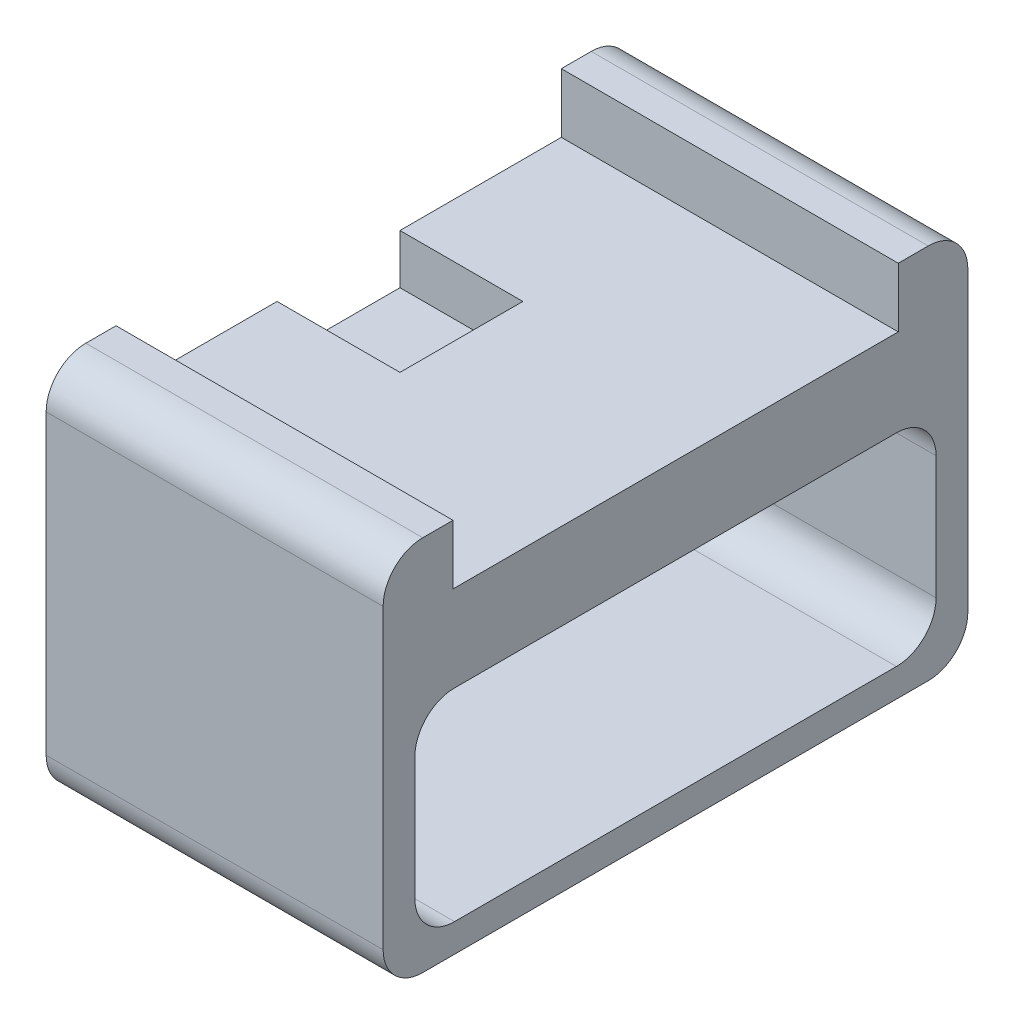
ISO-10303-21;
HEADER;
FILE_DESCRIPTION(('STEP AP214'),'2;1');
FILE_NAME('part.step','',(''),(''),'','','');
FILE_SCHEMA(('AUTOMOTIVE_DESIGN { 1 0 10303 214 1 1 1 1 }'));
ENDSEC;
DATA;
#1=APPLICATION_CONTEXT('core data for automotive mechanical design processes');
#2=APPLICATION_PROTOCOL_DEFINITION('international standard','automotive_design',2000,#1);
#3=PRODUCT_CONTEXT('',#1,'mechanical');
#4=PRODUCT('Part','Part','',(#3));
#5=PRODUCT_RELATED_PRODUCT_CATEGORY('part','',(#4));
#6=PRODUCT_DEFINITION_FORMATION('','',#4);
#7=PRODUCT_DEFINITION_CONTEXT('part definition',#1,'design');
#8=PRODUCT_DEFINITION('design','',#6,#7);
#9=PRODUCT_DEFINITION_SHAPE('','',#8);
#10=(LENGTH_UNIT() NAMED_UNIT(*) SI_UNIT(.MILLI.,.METRE.));
#11=(NAMED_UNIT(*) PLANE_ANGLE_UNIT() SI_UNIT($,.RADIAN.));
#12=(NAMED_UNIT(*) SI_UNIT($,.STERADIAN.) SOLID_ANGLE_UNIT());
#13=UNCERTAINTY_MEASURE_WITH_UNIT(LENGTH_MEASURE(1.E-05),#10,'distance_accuracy_value','');
#14=(GEOMETRIC_REPRESENTATION_CONTEXT(3) GLOBAL_UNCERTAINTY_ASSIGNED_CONTEXT((#13)) GLOBAL_UNIT_ASSIGNED_CONTEXT((#10,
#11,#12)) REPRESENTATION_CONTEXT('',''));
#15=CARTESIAN_POINT('',(0.,0.,0.));
#16=DIRECTION('',(0.,0.,1.));
#17=DIRECTION('',(1.,0.,0.));
#18=AXIS2_PLACEMENT_3D('',#15,#16,#17);
#19=CARTESIAN_POINT('',(21.,9.5,12.75));
#20=DIRECTION('',(0.,-1.,0.));
#21=DIRECTION('',(0.,0.,-1.));
#22=AXIS2_PLACEMENT_3D('',#19,#20,#21);
#23=PLANE('',#22);
#24=DIRECTION('',(0.,0.,1.));
#25=VECTOR('',#24,1.);
#26=CARTESIAN_POINT('',(17.,9.5,12.75));
#27=LINE('',#26,#25);
#28=CARTESIAN_POINT('',(17.,9.5,-12.75));
#29=VERTEX_POINT('',#28);
#30=CARTESIAN_POINT('',(17.,9.5,-11.2400373427258));
#31=VERTEX_POINT('',#30);
#32=EDGE_CURVE('E359',#29,#31,#27,.T.);
#33=ORIENTED_EDGE('',*,*,#32,.F.);
#34=DIRECTION('',(-1.,0.,0.));
#35=VECTOR('',#34,1.);
#36=CARTESIAN_POINT('',(21.,9.5,-12.75));
#37=LINE('',#36,#35);
#38=CARTESIAN_POINT('',(0.,9.5,-12.75));
#39=VERTEX_POINT('',#38);
#40=EDGE_CURVE('E301',#29,#39,#37,.T.);
#41=ORIENTED_EDGE('',*,*,#40,.T.);
#42=DIRECTION('',(0.,0.,1.));
#43=VECTOR('',#42,1.);
#44=CARTESIAN_POINT('',(0.,9.5,12.75));
#45=LINE('',#44,#43);
#46=CARTESIAN_POINT('',(0.,9.5,-11.2400373427258));
#47=VERTEX_POINT('',#46);
#48=EDGE_CURVE('E276',#39,#47,#45,.T.);
#49=ORIENTED_EDGE('',*,*,#48,.T.);
#50=DIRECTION('',(-1.,0.,0.));
#51=VECTOR('',#50,1.);
#52=CARTESIAN_POINT('',(0.,9.5,-11.2400373427258));
#53=LINE('',#52,#51);
#54=EDGE_CURVE('E218',#31,#47,#53,.T.);
#55=ORIENTED_EDGE('',*,*,#54,.F.);
#56=EDGE_LOOP('',(#33,#41,#49,#55));
#57=FACE_BOUND('',#56,.T.);
#58=ADVANCED_FACE('F33',(#57),#23,.F.);
#59=CARTESIAN_POINT('',(21.,-7.5,-12.75));
#60=DIRECTION('',(-1.,0.,0.));
#61=DIRECTION('',(0.,0.,1.));
#62=AXIS2_PLACEMENT_3D('',#59,#60,#61);
#63=CYLINDRICAL_SURFACE('',#62,2.);
#64=CARTESIAN_POINT('',(17.,-7.5,-12.75));
#65=DIRECTION('',(1.,0.,0.));
#66=DIRECTION('',(0.,0.,-1.));
#67=AXIS2_PLACEMENT_3D('',#64,#65,#66);
#68=CIRCLE('',#67,2.);
#69=CARTESIAN_POINT('',(17.,-9.49999999999999,-12.75));
#70=VERTEX_POINT('',#69);
#71=CARTESIAN_POINT('',(17.,-7.5,-14.75));
#72=VERTEX_POINT('',#71);
#73=EDGE_CURVE('E370',#70,#72,#68,.T.);
#74=ORIENTED_EDGE('',*,*,#73,.F.);
#75=DIRECTION('',(-1.,0.,0.));
#76=VECTOR('',#75,1.);
#77=CARTESIAN_POINT('',(21.,-9.5,-12.75));
#78=LINE('',#77,#76);
#79=CARTESIAN_POINT('',(0.,-9.5,-12.75));
#80=VERTEX_POINT('',#79);
#81=EDGE_CURVE('E291',#70,#80,#78,.T.);
#82=ORIENTED_EDGE('',*,*,#81,.T.);
#83=CARTESIAN_POINT('',(0.,-7.5,-12.75));
#84=DIRECTION('',(1.,0.,0.));
#85=DIRECTION('',(0.,0.,1.));
#86=AXIS2_PLACEMENT_3D('',#83,#84,#85);
#87=CIRCLE('',#86,2.);
#88=CARTESIAN_POINT('',(0.,-7.5,-14.75));
#89=VERTEX_POINT('',#88);
#90=EDGE_CURVE('E258',#80,#89,#87,.T.);
#91=ORIENTED_EDGE('',*,*,#90,.T.);
#92=DIRECTION('',(-1.,0.,0.));
#93=VECTOR('',#92,1.);
#94=CARTESIAN_POINT('',(21.,-7.5,-14.75));
#95=LINE('',#94,#93);
#96=EDGE_CURVE('E305',#72,#89,#95,.T.);
#97=ORIENTED_EDGE('',*,*,#96,.F.);
#98=EDGE_LOOP('',(#74,#82,#91,#97));
#99=FACE_BOUND('',#98,.T.);
#100=ADVANCED_FACE('F35',(#99),#63,.T.);
#101=CARTESIAN_POINT('',(21.,-7.5,-14.75));
#102=DIRECTION('',(0.,0.,1.));
#103=DIRECTION('',(0.,-1.,0.));
#104=AXIS2_PLACEMENT_3D('',#101,#102,#103);
#105=PLANE('',#104);
#106=DIRECTION('',(0.,1.,0.));
#107=VECTOR('',#106,1.);
#108=CARTESIAN_POINT('',(17.,-7.5,-14.75));
#109=LINE('',#108,#107);
#110=CARTESIAN_POINT('',(17.,7.5,-14.75));
#111=VERTEX_POINT('',#110);
#112=EDGE_CURVE('E368',#72,#111,#109,.T.);
#113=ORIENTED_EDGE('',*,*,#112,.F.);
#114=ORIENTED_EDGE('',*,*,#96,.T.);
#115=DIRECTION('',(0.,1.,0.));
#116=VECTOR('',#115,1.);
#117=CARTESIAN_POINT('',(0.,-7.5,-14.75));
#118=LINE('',#117,#116);
#119=CARTESIAN_POINT('',(0.,7.5,-14.75));
#120=VERTEX_POINT('',#119);
#121=EDGE_CURVE('E269',#89,#120,#118,.T.);
#122=ORIENTED_EDGE('',*,*,#121,.T.);
#123=DIRECTION('',(-1.,0.,0.));
#124=VECTOR('',#123,1.);
#125=CARTESIAN_POINT('',(21.,7.5,-14.75));
#126=LINE('',#125,#124);
#127=EDGE_CURVE('E303',#111,#120,#126,.T.);
#128=ORIENTED_EDGE('',*,*,#127,.F.);
#129=EDGE_LOOP('',(#113,#114,#122,#128));
#130=FACE_BOUND('',#129,.T.);
#131=ADVANCED_FACE('F443',(#130),#105,.F.);
#132=CARTESIAN_POINT('',(21.,7.5,-12.75));
#133=DIRECTION('',(-1.,0.,0.));
#134=DIRECTION('',(0.,0.,1.));
#135=AXIS2_PLACEMENT_3D('',#132,#133,#134);
#136=CYLINDRICAL_SURFACE('',#135,2.);
#137=CARTESIAN_POINT('',(17.,7.5,-12.75));
#138=DIRECTION('',(1.,0.,0.));
#139=DIRECTION('',(0.,0.,-1.));
#140=AXIS2_PLACEMENT_3D('',#137,#138,#139);
#141=CIRCLE('',#140,2.);
#142=EDGE_CURVE('E366',#111,#29,#141,.T.);
#143=ORIENTED_EDGE('',*,*,#142,.F.);
#144=ORIENTED_EDGE('',*,*,#127,.T.);
#145=CARTESIAN_POINT('',(0.,7.5,-12.75));
#146=DIRECTION('',(1.,0.,0.));
#147=DIRECTION('',(0.,0.,1.));
#148=AXIS2_PLACEMENT_3D('',#145,#146,#147);
#149=CIRCLE('',#148,2.);
#150=EDGE_CURVE('E272',#120,#39,#149,.T.);
#151=ORIENTED_EDGE('',*,*,#150,.T.);
#152=ORIENTED_EDGE('',*,*,#40,.F.);
#153=EDGE_LOOP('',(#143,#144,#151,#152));
#154=FACE_BOUND('',#153,.T.);
#155=ADVANCED_FACE('F450',(#154),#136,.T.);
#156=DIRECTION('',(0.,0.,1.));
#157=VECTOR('',#156,1.);
#158=CARTESIAN_POINT('',(17.,9.5,12.75));
#159=LINE('',#158,#157);
#160=CARTESIAN_POINT('',(17.,9.5,11.2248067322085));
#161=VERTEX_POINT('',#160);
#162=CARTESIAN_POINT('',(17.,9.5,12.75));
#163=VERTEX_POINT('',#162);
#164=EDGE_CURVE('E357',#161,#163,#159,.T.);
#165=ORIENTED_EDGE('',*,*,#164,.F.);
#166=DIRECTION('',(1.,0.,0.));
#167=VECTOR('',#166,1.);
#168=CARTESIAN_POINT('',(0.,9.5,11.2248067322085));
#169=LINE('',#168,#167);
#170=CARTESIAN_POINT('',(0.,9.5,11.2248067322085));
#171=VERTEX_POINT('',#170);
#172=EDGE_CURVE('E204',#171,#161,#169,.T.);
#173=ORIENTED_EDGE('',*,*,#172,.F.);
#174=CARTESIAN_POINT('',(0.,9.5,12.75));
#175=VERTEX_POINT('',#174);
#176=EDGE_CURVE('E275',#171,#175,#45,.T.);
#177=ORIENTED_EDGE('',*,*,#176,.T.);
#178=DIRECTION('',(-1.,0.,0.));
#179=VECTOR('',#178,1.);
#180=CARTESIAN_POINT('',(21.,9.5,12.75));
#181=LINE('',#180,#179);
#182=EDGE_CURVE('E299',#163,#175,#181,.T.);
#183=ORIENTED_EDGE('',*,*,#182,.F.);
#184=EDGE_LOOP('',(#165,#173,#177,#183));
#185=FACE_BOUND('',#184,.T.);
#186=ADVANCED_FACE('F355',(#185),#23,.F.);
#187=CARTESIAN_POINT('',(21.,7.5,12.75));
#188=DIRECTION('',(-1.,0.,0.));
#189=DIRECTION('',(0.,0.,1.));
#190=AXIS2_PLACEMENT_3D('',#187,#188,#189);
#191=CYLINDRICAL_SURFACE('',#190,2.);
#192=CARTESIAN_POINT('',(17.,7.5,12.75));
#193=DIRECTION('',(1.,0.,0.));
#194=DIRECTION('',(0.,0.,-1.));
#195=AXIS2_PLACEMENT_3D('',#192,#193,#194);
#196=CIRCLE('',#195,2.);
#197=CARTESIAN_POINT('',(17.,7.5,14.75));
#198=VERTEX_POINT('',#197);
#199=EDGE_CURVE('E361',#163,#198,#196,.T.);
#200=ORIENTED_EDGE('',*,*,#199,.F.);
#201=ORIENTED_EDGE('',*,*,#182,.T.);
#202=CARTESIAN_POINT('',(0.,7.5,12.75));
#203=DIRECTION('',(1.,0.,0.));
#204=DIRECTION('',(0.,0.,-1.));
#205=AXIS2_PLACEMENT_3D('',#202,#203,#204);
#206=CIRCLE('',#205,2.);
#207=CARTESIAN_POINT('',(0.,7.5,14.75));
#208=VERTEX_POINT('',#207);
#209=EDGE_CURVE('E279',#175,#208,#206,.T.);
#210=ORIENTED_EDGE('',*,*,#209,.T.);
#211=DIRECTION('',(-1.,0.,0.));
#212=VECTOR('',#211,1.);
#213=CARTESIAN_POINT('',(21.,7.5,14.75));
#214=LINE('',#213,#212);
#215=EDGE_CURVE('E297',#198,#208,#214,.T.);
#216=ORIENTED_EDGE('',*,*,#215,.F.);
#217=EDGE_LOOP('',(#200,#201,#210,#216));
#218=FACE_BOUND('',#217,.T.);
#219=ADVANCED_FACE('F449',(#218),#191,.T.);
#220=CARTESIAN_POINT('',(21.,-7.5,14.75));
#221=DIRECTION('',(0.,0.,-1.));
#222=DIRECTION('',(-1.,0.,0.));
#223=AXIS2_PLACEMENT_3D('',#220,#221,#222);
#224=PLANE('',#223);
#225=DIRECTION('',(0.,-1.,0.));
#226=VECTOR('',#225,1.);
#227=CARTESIAN_POINT('',(17.,-7.5,14.75));
#228=LINE('',#227,#226);
#229=CARTESIAN_POINT('',(17.,-7.5,14.75));
#230=VERTEX_POINT('',#229);
#231=EDGE_CURVE('E376',#198,#230,#228,.T.);
#232=ORIENTED_EDGE('',*,*,#231,.F.);
#233=ORIENTED_EDGE('',*,*,#215,.T.);
#234=DIRECTION('',(0.,-1.,0.));
#235=VECTOR('',#234,1.);
#236=CARTESIAN_POINT('',(0.,-7.5,14.75));
#237=LINE('',#236,#235);
#238=CARTESIAN_POINT('',(0.,-7.5,14.75));
#239=VERTEX_POINT('',#238);
#240=EDGE_CURVE('E282',#208,#239,#237,.T.);
#241=ORIENTED_EDGE('',*,*,#240,.T.);
#242=DIRECTION('',(-1.,0.,0.));
#243=VECTOR('',#242,1.);
#244=CARTESIAN_POINT('',(21.,-7.5,14.75));
#245=LINE('',#244,#243);
#246=EDGE_CURVE('E295',#230,#239,#245,.T.);
#247=ORIENTED_EDGE('',*,*,#246,.F.);
#248=EDGE_LOOP('',(#232,#233,#241,#247));
#249=FACE_BOUND('',#248,.T.);
#250=ADVANCED_FACE('F455',(#249),#224,.F.);
#251=CARTESIAN_POINT('',(21.,-7.5,12.75));
#252=DIRECTION('',(-1.,0.,0.));
#253=DIRECTION('',(0.,0.,1.));
#254=AXIS2_PLACEMENT_3D('',#251,#252,#253);
#255=CYLINDRICAL_SURFACE('',#254,2.);
#256=CARTESIAN_POINT('',(17.,-7.5,12.75));
#257=DIRECTION('',(1.,0.,0.));
#258=DIRECTION('',(0.,0.,-1.));
#259=AXIS2_PLACEMENT_3D('',#256,#257,#258);
#260=CIRCLE('',#259,2.);
#261=CARTESIAN_POINT('',(17.,-9.5,12.75));
#262=VERTEX_POINT('',#261);
#263=EDGE_CURVE('E374',#230,#262,#260,.T.);
#264=ORIENTED_EDGE('',*,*,#263,.F.);
#265=ORIENTED_EDGE('',*,*,#246,.T.);
#266=CARTESIAN_POINT('',(0.,-7.5,12.75));
#267=DIRECTION('',(1.,0.,0.));
#268=DIRECTION('',(0.,0.,-1.));
#269=AXIS2_PLACEMENT_3D('',#266,#267,#268);
#270=CIRCLE('',#269,2.);
#271=CARTESIAN_POINT('',(0.,-9.5,12.75));
#272=VERTEX_POINT('',#271);
#273=EDGE_CURVE('E285',#239,#272,#270,.T.);
#274=ORIENTED_EDGE('',*,*,#273,.T.);
#275=DIRECTION('',(-1.,0.,0.));
#276=VECTOR('',#275,1.);
#277=CARTESIAN_POINT('',(21.,-9.5,12.75));
#278=LINE('',#277,#276);
#279=EDGE_CURVE('E293',#262,#272,#278,.T.);
#280=ORIENTED_EDGE('',*,*,#279,.F.);
#281=EDGE_LOOP('',(#264,#265,#274,#280));
#282=FACE_BOUND('',#281,.T.);
#283=ADVANCED_FACE('F506',(#282),#255,.T.);
#284=CARTESIAN_POINT('',(21.,-9.5,12.75));
#285=DIRECTION('',(0.,1.,0.));
#286=DIRECTION('',(0.,0.,1.));
#287=AXIS2_PLACEMENT_3D('',#284,#285,#286);
#288=PLANE('',#287);
#289=DIRECTION('',(0.,0.,-1.));
#290=VECTOR('',#289,1.);
#291=CARTESIAN_POINT('',(17.,-9.5,12.75));
#292=LINE('',#291,#290);
#293=EDGE_CURVE('E372',#262,#70,#292,.T.);
#294=ORIENTED_EDGE('',*,*,#293,.F.);
#295=ORIENTED_EDGE('',*,*,#279,.T.);
#296=DIRECTION('',(0.,0.,-1.));
#297=VECTOR('',#296,1.);
#298=CARTESIAN_POINT('',(0.,-9.5,12.75));
#299=LINE('',#298,#297);
#300=EDGE_CURVE('E288',#272,#80,#299,.T.);
#301=ORIENTED_EDGE('',*,*,#300,.T.);
#302=ORIENTED_EDGE('',*,*,#81,.F.);
#303=EDGE_LOOP('',(#294,#295,#301,#302));
#304=FACE_BOUND('',#303,.T.);
#305=ADVANCED_FACE('F503',(#304),#288,.F.);
#306=CARTESIAN_POINT('',(21.,-6.07292875406995,11.147623692795));
#307=DIRECTION('',(-1.,0.,0.));
#308=DIRECTION('',(0.,0.,1.));
#309=AXIS2_PLACEMENT_3D('',#306,#307,#308);
#310=CYLINDRICAL_SURFACE('',#309,2.);
#311=CARTESIAN_POINT('',(17.,-6.07292875406995,11.147623692795));
#312=DIRECTION('',(1.,0.,0.));
#313=DIRECTION('',(0.,0.,-1.));
#314=AXIS2_PLACEMENT_3D('',#311,#312,#313);
#315=CIRCLE('',#314,2.);
#316=CARTESIAN_POINT('',(17.,-8.07292875406995,11.147623692795));
#317=VERTEX_POINT('',#316);
#318=CARTESIAN_POINT('',(17.,-6.07292875406995,13.147623692795));
#319=VERTEX_POINT('',#318);
#320=EDGE_CURVE('E48',#317,#319,#315,.F.);
#321=ORIENTED_EDGE('',*,*,#320,.F.);
#322=DIRECTION('',(-1.,0.,0.));
#323=VECTOR('',#322,1.);
#324=CARTESIAN_POINT('',(21.,-8.07292875406995,11.147623692795));
#325=LINE('',#324,#323);
#326=CARTESIAN_POINT('',(0.,-8.07292875406995,11.147623692795));
#327=VERTEX_POINT('',#326);
#328=EDGE_CURVE('E231',#317,#327,#325,.T.);
#329=ORIENTED_EDGE('',*,*,#328,.T.);
#330=CARTESIAN_POINT('',(0.,-6.07292875406995,11.147623692795));
#331=DIRECTION('',(-1.,0.,0.));
#332=DIRECTION('',(0.,0.,1.));
#333=AXIS2_PLACEMENT_3D('',#330,#331,#332);
#334=CIRCLE('',#333,2.);
#335=CARTESIAN_POINT('',(0.,-6.07292875406995,13.147623692795));
#336=VERTEX_POINT('',#335);
#337=EDGE_CURVE('E328',#327,#336,#334,.T.);
#338=ORIENTED_EDGE('',*,*,#337,.T.);
#339=DIRECTION('',(-1.,0.,0.));
#340=VECTOR('',#339,1.);
#341=CARTESIAN_POINT('',(21.,-6.07292875406995,13.147623692795));
#342=LINE('',#341,#340);
#343=EDGE_CURVE('E228',#319,#336,#342,.T.);
#344=ORIENTED_EDGE('',*,*,#343,.F.);
#345=EDGE_LOOP('',(#321,#329,#338,#344));
#346=FACE_BOUND('',#345,.T.);
#347=ADVANCED_FACE('F398',(#346),#310,.F.);
#348=CARTESIAN_POINT('',(21.,-8.07292875406995,-11.147623692795));
#349=DIRECTION('',(0.,-1.,0.));
#350=DIRECTION('',(0.,0.,-1.));
#351=AXIS2_PLACEMENT_3D('',#348,#349,#350);
#352=PLANE('',#351);
#353=DIRECTION('',(0.,0.,1.));
#354=VECTOR('',#353,1.);
#355=CARTESIAN_POINT('',(17.,-8.07292875406995,-11.147623692795));
#356=LINE('',#355,#354);
#357=CARTESIAN_POINT('',(17.,-8.07292875406995,-11.147623692795));
#358=VERTEX_POINT('',#357);
#359=EDGE_CURVE('E390',#358,#317,#356,.T.);
#360=ORIENTED_EDGE('',*,*,#359,.F.);
#361=DIRECTION('',(-1.,0.,0.));
#362=VECTOR('',#361,1.);
#363=CARTESIAN_POINT('',(21.,-8.07292875406995,-11.147623692795));
#364=LINE('',#363,#362);
#365=CARTESIAN_POINT('',(0.,-8.07292875406995,-11.147623692795));
#366=VERTEX_POINT('',#365);
#367=EDGE_CURVE('E229',#358,#366,#364,.T.);
#368=ORIENTED_EDGE('',*,*,#367,.T.);
#369=DIRECTION('',(0.,0.,-1.));
#370=VECTOR('',#369,1.);
#371=CARTESIAN_POINT('',(0.,-8.07292875406995,-11.147623692795));
#372=LINE('',#371,#370);
#373=EDGE_CURVE('E325',#366,#327,#372,.F.);
#374=ORIENTED_EDGE('',*,*,#373,.T.);
#375=ORIENTED_EDGE('',*,*,#328,.F.);
#376=EDGE_LOOP('',(#360,#368,#374,#375));
#377=FACE_BOUND('',#376,.T.);
#378=ADVANCED_FACE('F399',(#377),#352,.F.);
#379=CARTESIAN_POINT('',(21.,-6.07292875406995,-11.147623692795));
#380=DIRECTION('',(-1.,0.,0.));
#381=DIRECTION('',(0.,0.,1.));
#382=AXIS2_PLACEMENT_3D('',#379,#380,#381);
#383=CYLINDRICAL_SURFACE('',#382,2.);
#384=CARTESIAN_POINT('',(17.,-6.07292875406995,-11.147623692795));
#385=DIRECTION('',(1.,0.,0.));
#386=DIRECTION('',(0.,0.,-1.));
#387=AXIS2_PLACEMENT_3D('',#384,#385,#386);
#388=CIRCLE('',#387,2.);
#389=CARTESIAN_POINT('',(17.,-6.07292875406995,-13.147623692795));
#390=VERTEX_POINT('',#389);
#391=EDGE_CURVE('E388',#390,#358,#388,.F.);
#392=ORIENTED_EDGE('',*,*,#391,.F.);
#393=DIRECTION('',(-1.,0.,0.));
#394=VECTOR('',#393,1.);
#395=CARTESIAN_POINT('',(21.,-6.07292875406995,-13.147623692795));
#396=LINE('',#395,#394);
#397=CARTESIAN_POINT('',(0.,-6.07292875406995,-13.147623692795));
#398=VERTEX_POINT('',#397);
#399=EDGE_CURVE('E232',#390,#398,#396,.T.);
#400=ORIENTED_EDGE('',*,*,#399,.T.);
#401=CARTESIAN_POINT('',(0.,-6.07292875406995,-11.147623692795));
#402=DIRECTION('',(-1.,0.,0.));
#403=DIRECTION('',(0.,0.,1.));
#404=AXIS2_PLACEMENT_3D('',#401,#402,#403);
#405=CIRCLE('',#404,2.);
#406=EDGE_CURVE('E322',#398,#366,#405,.T.);
#407=ORIENTED_EDGE('',*,*,#406,.T.);
#408=ORIENTED_EDGE('',*,*,#367,.F.);
#409=EDGE_LOOP('',(#392,#400,#407,#408));
#410=FACE_BOUND('',#409,.T.);
#411=ADVANCED_FACE('F428',(#410),#383,.F.);
#412=CARTESIAN_POINT('',(21.,-6.07292875406995,-13.147623692795));
#413=DIRECTION('',(0.,0.,-1.));
#414=DIRECTION('',(-1.,0.,0.));
#415=AXIS2_PLACEMENT_3D('',#412,#413,#414);
#416=PLANE('',#415);
#417=DIRECTION('',(0.,-1.,0.));
#418=VECTOR('',#417,1.);
#419=CARTESIAN_POINT('',(17.,-6.07292875406995,-13.147623692795));
#420=LINE('',#419,#418);
#421=CARTESIAN_POINT('',(17.,0.135263403800991,-13.147623692795));
#422=VERTEX_POINT('',#421);
#423=EDGE_CURVE('E386',#422,#390,#420,.T.);
#424=ORIENTED_EDGE('',*,*,#423,.F.);
#425=DIRECTION('',(-1.,0.,0.));
#426=VECTOR('',#425,1.);
#427=CARTESIAN_POINT('',(21.,0.135263403800991,-13.147623692795));
#428=LINE('',#427,#426);
#429=CARTESIAN_POINT('',(0.,0.135263403800991,-13.147623692795));
#430=VERTEX_POINT('',#429);
#431=EDGE_CURVE('E238',#422,#430,#428,.T.);
#432=ORIENTED_EDGE('',*,*,#431,.T.);
#433=DIRECTION('',(0.,1.,0.));
#434=VECTOR('',#433,1.);
#435=CARTESIAN_POINT('',(0.,-6.07292875406995,-13.147623692795));
#436=LINE('',#435,#434);
#437=EDGE_CURVE('E319',#430,#398,#436,.F.);
#438=ORIENTED_EDGE('',*,*,#437,.T.);
#439=ORIENTED_EDGE('',*,*,#399,.F.);
#440=EDGE_LOOP('',(#424,#432,#438,#439));
#441=FACE_BOUND('',#440,.T.);
#442=ADVANCED_FACE('F425',(#441),#416,.F.);
#443=CARTESIAN_POINT('',(21.,0.135263403800991,-11.147623692795));
#444=DIRECTION('',(-1.,0.,0.));
#445=DIRECTION('',(0.,0.,1.));
#446=AXIS2_PLACEMENT_3D('',#443,#444,#445);
#447=CYLINDRICAL_SURFACE('',#446,2.);
#448=CARTESIAN_POINT('',(17.,0.135263403800991,-11.147623692795));
#449=DIRECTION('',(1.,0.,0.));
#450=DIRECTION('',(0.,0.,-1.));
#451=AXIS2_PLACEMENT_3D('',#448,#449,#450);
#452=CIRCLE('',#451,2.);
#453=CARTESIAN_POINT('',(17.,2.13526340380099,-11.147623692795));
#454=VERTEX_POINT('',#453);
#455=EDGE_CURVE('E384',#454,#422,#452,.F.);
#456=ORIENTED_EDGE('',*,*,#455,.F.);
#457=DIRECTION('',(-1.,0.,0.));
#458=VECTOR('',#457,1.);
#459=CARTESIAN_POINT('',(21.,2.13526340380099,-11.147623692795));
#460=LINE('',#459,#458);
#461=CARTESIAN_POINT('',(0.,2.13526340380099,-11.147623692795));
#462=VERTEX_POINT('',#461);
#463=EDGE_CURVE('E240',#454,#462,#460,.T.);
#464=ORIENTED_EDGE('',*,*,#463,.T.);
#465=CARTESIAN_POINT('',(0.,0.135263403800991,-11.147623692795));
#466=DIRECTION('',(-1.,0.,0.));
#467=DIRECTION('',(0.,0.,1.));
#468=AXIS2_PLACEMENT_3D('',#465,#466,#467);
#469=CIRCLE('',#468,2.);
#470=EDGE_CURVE('E316',#462,#430,#469,.T.);
#471=ORIENTED_EDGE('',*,*,#470,.T.);
#472=ORIENTED_EDGE('',*,*,#431,.F.);
#473=EDGE_LOOP('',(#456,#464,#471,#472));
#474=FACE_BOUND('',#473,.T.);
#475=ADVANCED_FACE('F422',(#474),#447,.F.);
#476=CARTESIAN_POINT('',(21.,2.13526340380099,-11.147623692795));
#477=DIRECTION('',(0.,1.,0.));
#478=DIRECTION('',(0.,0.,1.));
#479=AXIS2_PLACEMENT_3D('',#476,#477,#478);
#480=PLANE('',#479);
#481=DIRECTION('',(0.,0.,-1.));
#482=VECTOR('',#481,1.);
#483=CARTESIAN_POINT('',(17.,2.13526340380099,-11.147623692795));
#484=LINE('',#483,#482);
#485=CARTESIAN_POINT('',(17.,2.13526340380099,11.147623692795));
#486=VERTEX_POINT('',#485);
#487=EDGE_CURVE('E382',#486,#454,#484,.T.);
#488=ORIENTED_EDGE('',*,*,#487,.F.);
#489=DIRECTION('',(-1.,0.,0.));
#490=VECTOR('',#489,1.);
#491=CARTESIAN_POINT('',(21.,2.13526340380099,11.147623692795));
#492=LINE('',#491,#490);
#493=CARTESIAN_POINT('',(0.,2.13526340380099,11.147623692795));
#494=VERTEX_POINT('',#493);
#495=EDGE_CURVE('E242',#486,#494,#492,.T.);
#496=ORIENTED_EDGE('',*,*,#495,.T.);
#497=DIRECTION('',(0.,0.,1.));
#498=VECTOR('',#497,1.);
#499=CARTESIAN_POINT('',(0.,2.13526340380099,-11.147623692795));
#500=LINE('',#499,#498);
#501=EDGE_CURVE('E313',#494,#462,#500,.F.);
#502=ORIENTED_EDGE('',*,*,#501,.T.);
#503=ORIENTED_EDGE('',*,*,#463,.F.);
#504=EDGE_LOOP('',(#488,#496,#502,#503));
#505=FACE_BOUND('',#504,.T.);
#506=ADVANCED_FACE('F415',(#505),#480,.F.);
#507=CARTESIAN_POINT('',(21.,0.135263403800991,11.147623692795));
#508=DIRECTION('',(-1.,0.,0.));
#509=DIRECTION('',(0.,0.,1.));
#510=AXIS2_PLACEMENT_3D('',#507,#508,#509);
#511=CYLINDRICAL_SURFACE('',#510,2.);
#512=CARTESIAN_POINT('',(17.,0.135263403800991,11.147623692795));
#513=DIRECTION('',(1.,0.,0.));
#514=DIRECTION('',(0.,0.,-1.));
#515=AXIS2_PLACEMENT_3D('',#512,#513,#514);
#516=CIRCLE('',#515,2.);
#517=CARTESIAN_POINT('',(17.,0.135263403800992,13.147623692795));
#518=VERTEX_POINT('',#517);
#519=EDGE_CURVE('E380',#518,#486,#516,.F.);
#520=ORIENTED_EDGE('',*,*,#519,.F.);
#521=DIRECTION('',(-1.,0.,0.));
#522=VECTOR('',#521,1.);
#523=CARTESIAN_POINT('',(21.,0.135263403800991,13.147623692795));
#524=LINE('',#523,#522);
#525=CARTESIAN_POINT('',(0.,0.135263403800991,13.147623692795));
#526=VERTEX_POINT('',#525);
#527=EDGE_CURVE('E236',#518,#526,#524,.T.);
#528=ORIENTED_EDGE('',*,*,#527,.T.);
#529=CARTESIAN_POINT('',(0.,0.135263403800991,11.147623692795));
#530=DIRECTION('',(-1.,0.,0.));
#531=DIRECTION('',(0.,0.,1.));
#532=AXIS2_PLACEMENT_3D('',#529,#530,#531);
#533=CIRCLE('',#532,2.);
#534=EDGE_CURVE('E310',#526,#494,#533,.T.);
#535=ORIENTED_EDGE('',*,*,#534,.T.);
#536=ORIENTED_EDGE('',*,*,#495,.F.);
#537=EDGE_LOOP('',(#520,#528,#535,#536));
#538=FACE_BOUND('',#537,.T.);
#539=ADVANCED_FACE('F413',(#538),#511,.F.);
#540=CARTESIAN_POINT('',(21.,-6.07292875406995,13.147623692795));
#541=DIRECTION('',(0.,0.,1.));
#542=DIRECTION('',(1.,0.,0.));
#543=AXIS2_PLACEMENT_3D('',#540,#541,#542);
#544=PLANE('',#543);
#545=DIRECTION('',(0.,1.,0.));
#546=VECTOR('',#545,1.);
#547=CARTESIAN_POINT('',(17.,-6.07292875406995,13.147623692795));
#548=LINE('',#547,#546);
#549=EDGE_CURVE('E378',#319,#518,#548,.T.);
#550=ORIENTED_EDGE('',*,*,#549,.F.);
#551=ORIENTED_EDGE('',*,*,#343,.T.);
#552=DIRECTION('',(0.,1.,0.));
#553=VECTOR('',#552,1.);
#554=CARTESIAN_POINT('',(0.,-6.07292875406995,13.147623692795));
#555=LINE('',#554,#553);
#556=EDGE_CURVE('E307',#336,#526,#555,.T.);
#557=ORIENTED_EDGE('',*,*,#556,.T.);
#558=ORIENTED_EDGE('',*,*,#527,.F.);
#559=EDGE_LOOP('',(#550,#551,#557,#558));
#560=FACE_BOUND('',#559,.T.);
#561=ADVANCED_FACE('F408',(#560),#544,.F.);
#562=CARTESIAN_POINT('',(0.,6.5,-11.2400373427258));
#563=DIRECTION('',(0.,0.,-1.));
#564=DIRECTION('',(-1.,0.,0.));
#565=AXIS2_PLACEMENT_3D('',#562,#563,#564);
#566=PLANE('',#565);
#567=DIRECTION('',(0.,-1.,0.));
#568=VECTOR('',#567,1.);
#569=CARTESIAN_POINT('',(17.,6.5,-11.2400373427258));
#570=LINE('',#569,#568);
#571=CARTESIAN_POINT('',(17.,6.5,-11.2400373427258));
#572=VERTEX_POINT('',#571);
#573=EDGE_CURVE('E56',#31,#572,#570,.T.);
#574=ORIENTED_EDGE('',*,*,#573,.F.);
#575=ORIENTED_EDGE('',*,*,#54,.T.);
#576=DIRECTION('',(0.,1.,0.));
#577=VECTOR('',#576,1.);
#578=CARTESIAN_POINT('',(0.,6.5,-11.2400373427258));
#579=LINE('',#578,#577);
#580=CARTESIAN_POINT('',(0.,6.5,-11.2400373427258));
#581=VERTEX_POINT('',#580);
#582=EDGE_CURVE('E220',#581,#47,#579,.T.);
#583=ORIENTED_EDGE('',*,*,#582,.F.);
#584=DIRECTION('',(-1.,0.,0.));
#585=VECTOR('',#584,1.);
#586=CARTESIAN_POINT('',(0.,6.5,-11.2400373427258));
#587=LINE('',#586,#585);
#588=EDGE_CURVE('E209',#572,#581,#587,.T.);
#589=ORIENTED_EDGE('',*,*,#588,.F.);
#590=EDGE_LOOP('',(#574,#575,#583,#589));
#591=FACE_BOUND('',#590,.T.);
#592=ADVANCED_FACE('F474',(#591),#566,.F.);
#593=CARTESIAN_POINT('',(0.,6.5,11.2248067322085));
#594=DIRECTION('',(0.,0.,1.));
#595=DIRECTION('',(0.,-1.,0.));
#596=AXIS2_PLACEMENT_3D('',#593,#594,#595);
#597=PLANE('',#596);
#598=DIRECTION('',(0.,1.,0.));
#599=VECTOR('',#598,1.);
#600=CARTESIAN_POINT('',(17.,6.5,11.2248067322085));
#601=LINE('',#600,#599);
#602=CARTESIAN_POINT('',(17.,6.5,11.2248067322085));
#603=VERTEX_POINT('',#602);
#604=EDGE_CURVE('E192',#603,#161,#601,.T.);
#605=ORIENTED_EDGE('',*,*,#604,.F.);
#606=DIRECTION('',(1.,0.,0.));
#607=VECTOR('',#606,1.);
#608=CARTESIAN_POINT('',(0.,6.5,11.2248067322085));
#609=LINE('',#608,#607);
#610=CARTESIAN_POINT('',(0.,6.5,11.2248067322085));
#611=VERTEX_POINT('',#610);
#612=EDGE_CURVE('E201',#611,#603,#609,.T.);
#613=ORIENTED_EDGE('',*,*,#612,.F.);
#614=DIRECTION('',(0.,1.,0.));
#615=VECTOR('',#614,1.);
#616=CARTESIAN_POINT('',(0.,6.5,11.2248067322085));
#617=LINE('',#616,#615);
#618=EDGE_CURVE('E212',#611,#171,#617,.T.);
#619=ORIENTED_EDGE('',*,*,#618,.T.);
#620=ORIENTED_EDGE('',*,*,#172,.T.);
#621=EDGE_LOOP('',(#605,#613,#619,#620));
#622=FACE_BOUND('',#621,.T.);
#623=ADVANCED_FACE('F200',(#622),#597,.F.);
#624=CARTESIAN_POINT('',(0.,6.5,0.));
#625=DIRECTION('',(0.,1.,0.));
#626=DIRECTION('',(0.,0.,1.));
#627=AXIS2_PLACEMENT_3D('',#624,#625,#626);
#628=PLANE('',#627);
#629=ORIENTED_EDGE('',*,*,#612,.T.);
#630=DIRECTION('',(0.,0.,-1.));
#631=VECTOR('',#630,1.);
#632=CARTESIAN_POINT('',(17.,6.5,0.));
#633=LINE('',#632,#631);
#634=EDGE_CURVE('E11',#603,#572,#633,.T.);
#635=ORIENTED_EDGE('',*,*,#634,.T.);
#636=ORIENTED_EDGE('',*,*,#588,.T.);
#637=DIRECTION('',(0.,0.,1.));
#638=VECTOR('',#637,1.);
#639=CARTESIAN_POINT('',(0.,6.5,-11.2400373427258));
#640=LINE('',#639,#638);
#641=CARTESIAN_POINT('',(0.,6.5,-3.1));
#642=VERTEX_POINT('',#641);
#643=EDGE_CURVE('E210',#581,#642,#640,.T.);
#644=ORIENTED_EDGE('',*,*,#643,.T.);
#645=DIRECTION('',(1.,0.,0.));
#646=VECTOR('',#645,1.);
#647=CARTESIAN_POINT('',(6.2,6.5,-3.1));
#648=LINE('',#647,#646);
#649=CARTESIAN_POINT('',(6.2,6.5,-3.1));
#650=VERTEX_POINT('',#649);
#651=EDGE_CURVE('E41',#642,#650,#648,.T.);
#652=ORIENTED_EDGE('',*,*,#651,.T.);
#653=DIRECTION('',(0.,0.,1.));
#654=VECTOR('',#653,1.);
#655=CARTESIAN_POINT('',(6.2,6.5,-3.1));
#656=LINE('',#655,#654);
#657=CARTESIAN_POINT('',(6.2,6.5,3.1));
#658=VERTEX_POINT('',#657);
#659=EDGE_CURVE('E223',#650,#658,#656,.T.);
#660=ORIENTED_EDGE('',*,*,#659,.T.);
#661=DIRECTION('',(-1.,0.,0.));
#662=VECTOR('',#661,1.);
#663=CARTESIAN_POINT('',(6.2,6.5,3.1));
#664=LINE('',#663,#662);
#665=CARTESIAN_POINT('',(0.,6.5,3.1));
#666=VERTEX_POINT('',#665);
#667=EDGE_CURVE('E226',#658,#666,#664,.T.);
#668=ORIENTED_EDGE('',*,*,#667,.T.);
#669=EDGE_CURVE('E208',#666,#611,#640,.T.);
#670=ORIENTED_EDGE('',*,*,#669,.T.);
#671=EDGE_LOOP('',(#629,#635,#636,#644,#652,#660,#668,#670));
#672=FACE_BOUND('',#671,.T.);
#673=ADVANCED_FACE('F206',(#672),#628,.T.);
#674=CARTESIAN_POINT('',(6.2,4.,-3.1));
#675=DIRECTION('',(1.,0.,0.));
#676=DIRECTION('',(0.,0.,-1.));
#677=AXIS2_PLACEMENT_3D('',#674,#675,#676);
#678=PLANE('',#677);
#679=ORIENTED_EDGE('',*,*,#659,.F.);
#680=DIRECTION('',(0.,1.,0.));
#681=VECTOR('',#680,1.);
#682=CARTESIAN_POINT('',(6.2,4.,-3.1));
#683=LINE('',#682,#681);
#684=CARTESIAN_POINT('',(6.2,4.,-3.1));
#685=VERTEX_POINT('',#684);
#686=EDGE_CURVE('E254',#685,#650,#683,.T.);
#687=ORIENTED_EDGE('',*,*,#686,.F.);
#688=DIRECTION('',(0.,0.,-1.));
#689=VECTOR('',#688,1.);
#690=CARTESIAN_POINT('',(6.2,4.,-3.1));
#691=LINE('',#690,#689);
#692=CARTESIAN_POINT('',(6.2,4.,3.1));
#693=VERTEX_POINT('',#692);
#694=EDGE_CURVE('E234',#693,#685,#691,.T.);
#695=ORIENTED_EDGE('',*,*,#694,.F.);
#696=DIRECTION('',(0.,1.,0.));
#697=VECTOR('',#696,1.);
#698=CARTESIAN_POINT('',(6.2,4.,3.1));
#699=LINE('',#698,#697);
#700=EDGE_CURVE('E255',#693,#658,#699,.T.);
#701=ORIENTED_EDGE('',*,*,#700,.T.);
#702=EDGE_LOOP('',(#679,#687,#695,#701));
#703=FACE_BOUND('',#702,.T.);
#704=ADVANCED_FACE('F337',(#703),#678,.F.);
#705=CARTESIAN_POINT('',(6.2,4.,3.1));
#706=DIRECTION('',(0.,0.,1.));
#707=DIRECTION('',(1.,0.,0.));
#708=AXIS2_PLACEMENT_3D('',#705,#706,#707);
#709=PLANE('',#708);
#710=ORIENTED_EDGE('',*,*,#667,.F.);
#711=ORIENTED_EDGE('',*,*,#700,.F.);
#712=DIRECTION('',(1.,0.,0.));
#713=VECTOR('',#712,1.);
#714=CARTESIAN_POINT('',(6.2,4.,3.1));
#715=LINE('',#714,#713);
#716=CARTESIAN_POINT('',(0.,4.,3.1));
#717=VERTEX_POINT('',#716);
#718=EDGE_CURVE('E251',#717,#693,#715,.T.);
#719=ORIENTED_EDGE('',*,*,#718,.F.);
#720=DIRECTION('',(0.,1.,0.));
#721=VECTOR('',#720,1.);
#722=CARTESIAN_POINT('',(0.,4.,3.1));
#723=LINE('',#722,#721);
#724=EDGE_CURVE('E259',#717,#666,#723,.T.);
#725=ORIENTED_EDGE('',*,*,#724,.T.);
#726=EDGE_LOOP('',(#710,#711,#719,#725));
#727=FACE_BOUND('',#726,.T.);
#728=ADVANCED_FACE('F347',(#727),#709,.F.);
#729=CARTESIAN_POINT('',(6.2,4.,-3.1));
#730=DIRECTION('',(0.,0.,-1.));
#731=DIRECTION('',(-1.,0.,0.));
#732=AXIS2_PLACEMENT_3D('',#729,#730,#731);
#733=PLANE('',#732);
#734=ORIENTED_EDGE('',*,*,#651,.F.);
#735=DIRECTION('',(0.,1.,0.));
#736=VECTOR('',#735,1.);
#737=CARTESIAN_POINT('',(0.,4.,-3.1));
#738=LINE('',#737,#736);
#739=CARTESIAN_POINT('',(0.,4.,-3.1));
#740=VERTEX_POINT('',#739);
#741=EDGE_CURVE('E262',#740,#642,#738,.T.);
#742=ORIENTED_EDGE('',*,*,#741,.F.);
#743=DIRECTION('',(-1.,0.,0.));
#744=VECTOR('',#743,1.);
#745=CARTESIAN_POINT('',(6.2,4.,-3.1));
#746=LINE('',#745,#744);
#747=EDGE_CURVE('E247',#685,#740,#746,.T.);
#748=ORIENTED_EDGE('',*,*,#747,.F.);
#749=ORIENTED_EDGE('',*,*,#686,.T.);
#750=EDGE_LOOP('',(#734,#742,#748,#749));
#751=FACE_BOUND('',#750,.T.);
#752=ADVANCED_FACE('F340',(#751),#733,.F.);
#753=CARTESIAN_POINT('',(0.,-7.5,-12.75));
#754=DIRECTION('',(-1.,0.,0.));
#755=DIRECTION('',(0.,0.,1.));
#756=AXIS2_PLACEMENT_3D('',#753,#754,#755);
#757=PLANE('',#756);
#758=ORIENTED_EDGE('',*,*,#618,.F.);
#759=ORIENTED_EDGE('',*,*,#669,.F.);
#760=ORIENTED_EDGE('',*,*,#724,.F.);
#761=DIRECTION('',(0.,0.,1.));
#762=VECTOR('',#761,1.);
#763=CARTESIAN_POINT('',(0.,4.,-3.1));
#764=LINE('',#763,#762);
#765=EDGE_CURVE('E249',#740,#717,#764,.T.);
#766=ORIENTED_EDGE('',*,*,#765,.F.);
#767=ORIENTED_EDGE('',*,*,#741,.T.);
#768=ORIENTED_EDGE('',*,*,#643,.F.);
#769=ORIENTED_EDGE('',*,*,#582,.T.);
#770=ORIENTED_EDGE('',*,*,#48,.F.);
#771=ORIENTED_EDGE('',*,*,#150,.F.);
#772=ORIENTED_EDGE('',*,*,#121,.F.);
#773=ORIENTED_EDGE('',*,*,#90,.F.);
#774=ORIENTED_EDGE('',*,*,#300,.F.);
#775=ORIENTED_EDGE('',*,*,#273,.F.);
#776=ORIENTED_EDGE('',*,*,#240,.F.);
#777=ORIENTED_EDGE('',*,*,#209,.F.);
#778=ORIENTED_EDGE('',*,*,#176,.F.);
#779=EDGE_LOOP('',(#758,#759,#760,#766,#767,#768,#769,#770,#771,#772,#773,#774,#775,#776,#777,#778));
#780=FACE_BOUND('',#779,.T.);
#781=ORIENTED_EDGE('',*,*,#337,.F.);
#782=ORIENTED_EDGE('',*,*,#373,.F.);
#783=ORIENTED_EDGE('',*,*,#406,.F.);
#784=ORIENTED_EDGE('',*,*,#437,.F.);
#785=ORIENTED_EDGE('',*,*,#470,.F.);
#786=ORIENTED_EDGE('',*,*,#501,.F.);
#787=ORIENTED_EDGE('',*,*,#534,.F.);
#788=ORIENTED_EDGE('',*,*,#556,.F.);
#789=EDGE_LOOP('',(#781,#782,#783,#784,#785,#786,#787,#788));
#790=FACE_BOUND('',#789,.T.);
#791=ADVANCED_FACE('F349',(#780,#790),#757,.T.);
#792=CARTESIAN_POINT('',(0.,4.,0.));
#793=DIRECTION('',(0.,-1.,0.));
#794=DIRECTION('',(0.,0.,-1.));
#795=AXIS2_PLACEMENT_3D('',#792,#793,#794);
#796=PLANE('',#795);
#797=ORIENTED_EDGE('',*,*,#694,.T.);
#798=ORIENTED_EDGE('',*,*,#747,.T.);
#799=ORIENTED_EDGE('',*,*,#765,.T.);
#800=ORIENTED_EDGE('',*,*,#718,.T.);
#801=EDGE_LOOP('',(#797,#798,#799,#800));
#802=FACE_BOUND('',#801,.T.);
#803=ADVANCED_FACE('F343',(#802),#796,.F.);
#804=CARTESIAN_POINT('',(17.,0.,0.));
#805=DIRECTION('',(1.,0.,0.));
#806=DIRECTION('',(0.,0.,-1.));
#807=AXIS2_PLACEMENT_3D('',#804,#805,#806);
#808=PLANE('',#807);
#809=ORIENTED_EDGE('',*,*,#231,.T.);
#810=ORIENTED_EDGE('',*,*,#263,.T.);
#811=ORIENTED_EDGE('',*,*,#293,.T.);
#812=ORIENTED_EDGE('',*,*,#73,.T.);
#813=ORIENTED_EDGE('',*,*,#112,.T.);
#814=ORIENTED_EDGE('',*,*,#142,.T.);
#815=ORIENTED_EDGE('',*,*,#32,.T.);
#816=ORIENTED_EDGE('',*,*,#573,.T.);
#817=ORIENTED_EDGE('',*,*,#634,.F.);
#818=ORIENTED_EDGE('',*,*,#604,.T.);
#819=ORIENTED_EDGE('',*,*,#164,.T.);
#820=ORIENTED_EDGE('',*,*,#199,.T.);
#821=EDGE_LOOP('',(#809,#810,#811,#812,#813,#814,#815,#816,#817,#818,#819,#820));
#822=FACE_BOUND('',#821,.T.);
#823=ORIENTED_EDGE('',*,*,#320,.T.);
#824=ORIENTED_EDGE('',*,*,#549,.T.);
#825=ORIENTED_EDGE('',*,*,#519,.T.);
#826=ORIENTED_EDGE('',*,*,#487,.T.);
#827=ORIENTED_EDGE('',*,*,#455,.T.);
#828=ORIENTED_EDGE('',*,*,#423,.T.);
#829=ORIENTED_EDGE('',*,*,#391,.T.);
#830=ORIENTED_EDGE('',*,*,#359,.T.);
#831=EDGE_LOOP('',(#823,#824,#825,#826,#827,#828,#829,#830));
#832=FACE_BOUND('',#831,.T.);
#833=ADVANCED_FACE('F191',(#822,#832),#808,.T.);
#834=CLOSED_SHELL('',(#58,#100,#131,#155,#186,#219,#250,#283,#305,#347,#378,#411,#442,#475,#506,
#539,#561,#592,#623,#673,#704,#728,#752,#791,#803,#833));
#835=MANIFOLD_SOLID_BREP('B2',#834);
#836=ADVANCED_BREP_SHAPE_REPRESENTATION('',(#18,#835),#14);
#837=SHAPE_DEFINITION_REPRESENTATION(#9,#836);
ENDSEC;
END-ISO-10303-21;
